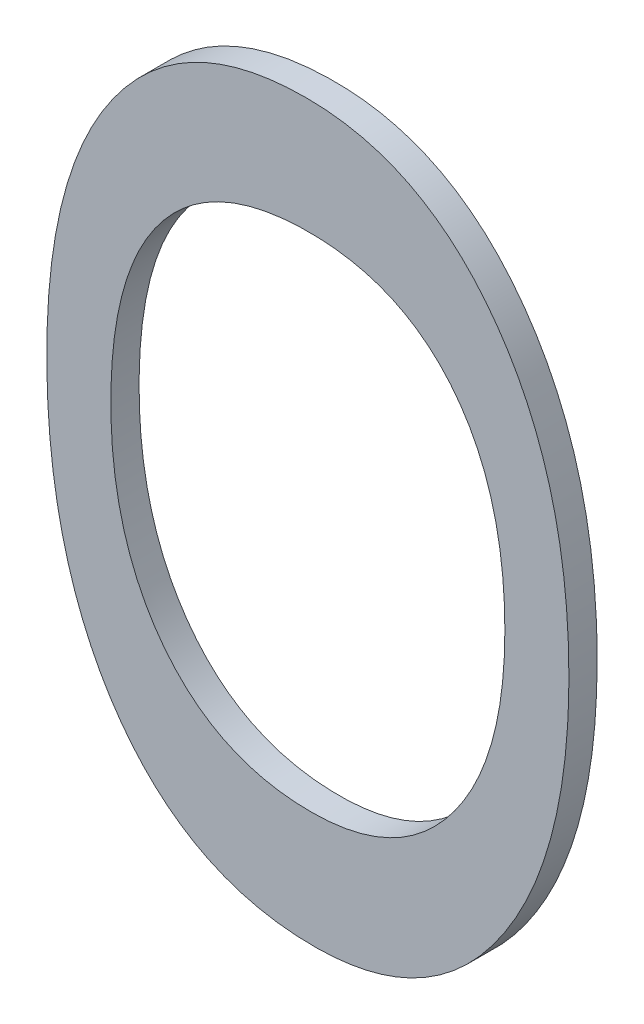
ISO-10303-21;
HEADER;
FILE_DESCRIPTION(('STEP AP214'),'2;1');
FILE_NAME('part.step','',(''),(''),'','','');
FILE_SCHEMA(('AUTOMOTIVE_DESIGN { 1 0 10303 214 1 1 1 1 }'));
ENDSEC;
DATA;
#1=APPLICATION_CONTEXT('core data for automotive mechanical design processes');
#2=APPLICATION_PROTOCOL_DEFINITION('international standard','automotive_design',2000,#1);
#3=PRODUCT_CONTEXT('',#1,'mechanical');
#4=PRODUCT('Part','Part','',(#3));
#5=PRODUCT_RELATED_PRODUCT_CATEGORY('part','',(#4));
#6=PRODUCT_DEFINITION_FORMATION('','',#4);
#7=PRODUCT_DEFINITION_CONTEXT('part definition',#1,'design');
#8=PRODUCT_DEFINITION('design','',#6,#7);
#9=PRODUCT_DEFINITION_SHAPE('','',#8);
#10=(LENGTH_UNIT() NAMED_UNIT(*) SI_UNIT(.MILLI.,.METRE.));
#11=(NAMED_UNIT(*) PLANE_ANGLE_UNIT() SI_UNIT($,.RADIAN.));
#12=(NAMED_UNIT(*) SI_UNIT($,.STERADIAN.) SOLID_ANGLE_UNIT());
#13=UNCERTAINTY_MEASURE_WITH_UNIT(LENGTH_MEASURE(1.E-05),#10,'distance_accuracy_value','');
#14=(GEOMETRIC_REPRESENTATION_CONTEXT(3) GLOBAL_UNCERTAINTY_ASSIGNED_CONTEXT((#13)) GLOBAL_UNIT_ASSIGNED_CONTEXT((#10,
#11,#12)) REPRESENTATION_CONTEXT('',''));
#15=CARTESIAN_POINT('',(0.,0.,0.));
#16=DIRECTION('',(0.,0.,1.));
#17=DIRECTION('',(1.,0.,0.));
#18=AXIS2_PLACEMENT_3D('',#15,#16,#17);
#19=CARTESIAN_POINT('',(-8.95983005625009,-22.7704584365744,333.160489148867));
#20=DIRECTION('',(0.,0.,1.));
#21=DIRECTION('',(1.,0.,0.));
#22=AXIS2_PLACEMENT_3D('',#19,#20,#21);
#23=PLANE('',#22);
#24=CARTESIAN_POINT('',(-6.29001147151449,-29.387682783152,333.160489148867));
#25=CARTESIAN_POINT('',(-6.29001147151449,-30.5322329388856,333.160489148867));
#26=CARTESIAN_POINT('',(-6.5358426870482,-31.4576896970962,333.160489148867));
#27=CARTESIAN_POINT('',(-7.51916511930408,-32.8704193496428,333.160489148867));
#28=CARTESIAN_POINT('',(-8.17524647300516,-33.2236014417225,333.160489148867));
#29=CARTESIAN_POINT('',(-9.87690675396641,-33.2236014417225,333.160489148867));
#30=CARTESIAN_POINT('',(-10.5705007487846,-32.8632360645508,333.160489148867));
#31=CARTESIAN_POINT('',(-11.5825575457215,-31.4217732975757,333.160489148867));
#32=CARTESIAN_POINT('',(-11.8355718681491,-30.4412435124195,333.160489148867));
#33=CARTESIAN_POINT('',(-11.8355718681491,-28.0324207393664,333.160489148867));
#34=CARTESIAN_POINT('',(-11.5913376108739,-27.1165410723687,333.160489148867));
#35=CARTESIAN_POINT('',(-10.6143992419472,-25.7900127608683,333.160489148867));
#36=CARTESIAN_POINT('',(-9.93916261334142,-25.4583802127562,333.160489148867));
#37=CARTESIAN_POINT('',(-8.24069481584198,-25.4583802127562,333.160489148867));
#38=CARTESIAN_POINT('',(-7.56705473886371,-25.8175489856235,333.160489148867));
#39=CARTESIAN_POINT('',(-6.54541987593813,-27.2542223101119,333.160489148867));
#40=CARTESIAN_POINT('',(-6.29001147151449,-28.2048215807125,333.160489148867));
#41=CARTESIAN_POINT('',(-6.29001147151449,-29.387682783152,333.160489148867));
#42=(BOUNDED_CURVE() B_SPLINE_CURVE(3,(#24,#25,#26,#27,#28,#29,#30,#31,#32,#33,#34,#35,#36,#37,
#38,#39,#40,#41),.UNSPECIFIED.,.T.,.F.) B_SPLINE_CURVE_WITH_KNOTS((4,2,2,2,2,2,2,2,4),(0.,
0.122928190053667,0.245856351944826,0.377872553464439,0.509888688329001,0.634259060932158,
0.758629365308048,0.879314652967576,1.),
.UNSPECIFIED.) CURVE() GEOMETRIC_REPRESENTATION_ITEM() RATIONAL_B_SPLINE_CURVE((1.,1.,1.,1.,1.,
1.,1.,1.,1.,1.,1.,1.,1.,1.,1.,1.,1.,1.)) REPRESENTATION_ITEM(''));
#43=CARTESIAN_POINT('',(-6.29001147151449,-29.387682783152,333.160489148867));
#44=VERTEX_POINT('',#43);
#45=EDGE_CURVE('E11',#44,#44,#42,.T.);
#46=ORIENTED_EDGE('',*,*,#45,.T.);
#47=EDGE_LOOP('',(#46));
#48=FACE_BOUND('',#47,.T.);
#49=CARTESIAN_POINT('',(-6.97003701237988,-29.301482318635,333.160489148867));
#50=CARTESIAN_POINT('',(-6.97003701237988,-28.4682115679244,333.160489148867));
#51=CARTESIAN_POINT('',(-7.15201513136967,-27.822905579865,333.160489148867));
#52=CARTESIAN_POINT('',(-7.8799303417068,-26.9082241476223,333.160489148867));
#53=CARTESIAN_POINT('',(-8.39074752468784,-26.6795522910559,333.160489148867));
#54=CARTESIAN_POINT('',(-9.72206513286093,-26.6795534001588,333.160489148867));
#55=CARTESIAN_POINT('',(-10.2416626137619,-26.9058290999534,333.160489148867));
#56=CARTESIAN_POINT('',(-10.9727692599526,-27.8109333602922,333.160489148867));
#57=CARTESIAN_POINT('',(-11.1555467101181,-28.458634117539,333.160489148867));
#58=CARTESIAN_POINT('',(-11.1555459531499,-30.1251753032849,333.160489148867));
#59=CARTESIAN_POINT('',(-10.9663841527485,-30.7812563704403,333.160489148867));
#60=CARTESIAN_POINT('',(-10.2097361560097,-31.7581942902802,333.160489148867));
#61=CARTESIAN_POINT('',(-9.69013917584141,-32.0024288155206,333.160489148867));
#62=CARTESIAN_POINT('',(-8.4035178326689,-32.0024288155206,333.160489148867));
#63=CARTESIAN_POINT('',(-7.90387503822888,-31.7569971463801,333.160489148867));
#64=CARTESIAN_POINT('',(-7.15680459050488,-30.7752701425276,333.160489148867));
#65=CARTESIAN_POINT('',(-6.97003701237988,-30.1203862974918,333.160489148867));
#66=CARTESIAN_POINT('',(-6.97003701237988,-29.301482318635,333.160489148867));
#67=(BOUNDED_CURVE() B_SPLINE_CURVE(3,(#49,#50,#51,#52,#53,#54,#55,#56,#57,#58,#59,#60,#61,#62,
#63,#64,#65,#66),.UNSPECIFIED.,.T.,.F.) B_SPLINE_CURVE_WITH_KNOTS((4,2,2,2,2,2,2,2,4),(0.,
0.125847552098494,0.251694915101053,0.380596777442791,0.509498684426021,0.635471067533667,
0.761443497351189,0.880721770265637,1.),
.UNSPECIFIED.) CURVE() GEOMETRIC_REPRESENTATION_ITEM() RATIONAL_B_SPLINE_CURVE((1.,1.,1.,1.,1.,
1.,1.,1.,1.,1.,1.,1.,1.,1.,1.,1.,1.,1.)) REPRESENTATION_ITEM(''));
#68=CARTESIAN_POINT('',(-6.97003701237988,-29.301482318635,333.160489148867));
#69=VERTEX_POINT('',#68);
#70=EDGE_CURVE('E46',#69,#69,#67,.T.);
#71=ORIENTED_EDGE('',*,*,#70,.T.);
#72=EDGE_LOOP('',(#71));
#73=FACE_BOUND('',#72,.T.);
#74=ADVANCED_FACE('F43',(#48,#73),#23,.F.);
#75=CARTESIAN_POINT('',(-6.29001147151449,-29.387682783152,332.960489148867));
#76=CARTESIAN_POINT('',(-6.29001147151449,-30.5322329388856,332.960489148867));
#77=CARTESIAN_POINT('',(-6.5358426870482,-31.4576896970962,332.960489148867));
#78=CARTESIAN_POINT('',(-7.51916511930408,-32.8704193496428,332.960489148867));
#79=CARTESIAN_POINT('',(-8.17524647300516,-33.2236014417225,332.960489148867));
#80=CARTESIAN_POINT('',(-9.87690675396641,-33.2236014417225,332.960489148867));
#81=CARTESIAN_POINT('',(-10.5705007487846,-32.8632360645508,332.960489148867));
#82=CARTESIAN_POINT('',(-11.5825575457215,-31.4217732975757,332.960489148867));
#83=CARTESIAN_POINT('',(-11.8355718681491,-30.4412435124195,332.960489148867));
#84=CARTESIAN_POINT('',(-11.8355718681491,-28.0324207393664,332.960489148867));
#85=CARTESIAN_POINT('',(-11.5913376108739,-27.1165410723687,332.960489148867));
#86=CARTESIAN_POINT('',(-10.6143992419472,-25.7900127608683,332.960489148867));
#87=CARTESIAN_POINT('',(-9.93916261334142,-25.4583802127562,332.960489148867));
#88=CARTESIAN_POINT('',(-8.24069481584198,-25.4583802127562,332.960489148867));
#89=CARTESIAN_POINT('',(-7.56705473886371,-25.8175489856235,332.960489148867));
#90=CARTESIAN_POINT('',(-6.54541987593813,-27.2542223101119,332.960489148867));
#91=CARTESIAN_POINT('',(-6.29001147151449,-28.2048215807125,332.960489148867));
#92=CARTESIAN_POINT('',(-6.29001147151449,-29.387682783152,332.960489148867));
#93=(BOUNDED_CURVE() B_SPLINE_CURVE(3,(#75,#76,#77,#78,#79,#80,#81,#82,#83,#84,#85,#86,#87,#88,
#89,#90,#91,#92),.UNSPECIFIED.,.T.,.F.) B_SPLINE_CURVE_WITH_KNOTS((4,2,2,2,2,2,2,2,4),(0.,
0.122928190053667,0.245856351944826,0.377872553464439,0.509888688329001,0.634259060932158,
0.758629365308048,0.879314652967576,1.),
.UNSPECIFIED.) CURVE() GEOMETRIC_REPRESENTATION_ITEM() RATIONAL_B_SPLINE_CURVE((1.,1.,1.,1.,1.,
1.,1.,1.,1.,1.,1.,1.,1.,1.,1.,1.,1.,1.)) REPRESENTATION_ITEM(''));
#94=DIRECTION('',(0.,0.,1.));
#95=VECTOR('',#94,1.);
#96=SURFACE_OF_LINEAR_EXTRUSION('',#93,#95);
#97=ORIENTED_EDGE('',*,*,#45,.F.);
#98=EDGE_LOOP('',(#97));
#99=FACE_BOUND('',#98,.T.);
#100=CARTESIAN_POINT('',(-6.29001147151449,-29.387682783152,333.460489148867));
#101=CARTESIAN_POINT('',(-6.29001147151449,-28.2048215807125,333.460489148867));
#102=CARTESIAN_POINT('',(-6.54541987593813,-27.2542223101119,333.460489148867));
#103=CARTESIAN_POINT('',(-7.56705473886371,-25.8175489856235,333.460489148867));
#104=CARTESIAN_POINT('',(-8.24069481584198,-25.4583802127562,333.460489148867));
#105=CARTESIAN_POINT('',(-9.93916261334142,-25.4583802127562,333.460489148867));
#106=CARTESIAN_POINT('',(-10.6143992419472,-25.7900127608683,333.460489148867));
#107=CARTESIAN_POINT('',(-11.5913376108739,-27.1165410723687,333.460489148867));
#108=CARTESIAN_POINT('',(-11.8355718681491,-28.0324207393664,333.460489148867));
#109=CARTESIAN_POINT('',(-11.8355718681491,-30.4412435124195,333.460489148867));
#110=CARTESIAN_POINT('',(-11.5825575457215,-31.4217732975757,333.460489148867));
#111=CARTESIAN_POINT('',(-10.5705007487846,-32.8632360645508,333.460489148867));
#112=CARTESIAN_POINT('',(-9.87690675396641,-33.2236014417225,333.460489148867));
#113=CARTESIAN_POINT('',(-8.17524647300516,-33.2236014417225,333.460489148867));
#114=CARTESIAN_POINT('',(-7.51916511930408,-32.8704193496428,333.460489148867));
#115=CARTESIAN_POINT('',(-6.5358426870482,-31.4576896970962,333.460489148867));
#116=CARTESIAN_POINT('',(-6.29001147151449,-30.5322329388856,333.460489148867));
#117=CARTESIAN_POINT('',(-6.29001147151449,-29.387682783152,333.460489148867));
#118=(BOUNDED_CURVE() B_SPLINE_CURVE(3,(#100,#101,#102,#103,#104,#105,#106,#107,#108,#109,#110,
#111,#112,#113,#114,#115,#116,#117),.UNSPECIFIED.,.T.,.F.) B_SPLINE_CURVE_WITH_KNOTS((4,2,2,2,2,
2,2,2,4),(0.,0.120685347032424,0.241370634691952,0.365740939067842,0.490111311670999,
0.622127446535561,0.754143648055174,0.877071809946333,1.),
.UNSPECIFIED.) CURVE() GEOMETRIC_REPRESENTATION_ITEM() RATIONAL_B_SPLINE_CURVE((1.,1.,1.,1.,1.,
1.,1.,1.,1.,1.,1.,1.,1.,1.,1.,1.,1.,1.)) REPRESENTATION_ITEM(''));
#119=CARTESIAN_POINT('',(-6.29001147151449,-29.387682783152,333.460489148867));
#120=VERTEX_POINT('',#119);
#121=EDGE_CURVE('E53',#120,#120,#118,.T.);
#122=ORIENTED_EDGE('',*,*,#121,.F.);
#123=EDGE_LOOP('',(#122));
#124=FACE_BOUND('',#123,.T.);
#125=ADVANCED_FACE('F103',(#99,#124),#96,.F.);
#126=CARTESIAN_POINT('',(-11.8313130441182,-29.475263028758,333.460489148867));
#127=DIRECTION('',(0.,0.,-1.));
#128=DIRECTION('',(0.,-1.,0.));
#129=AXIS2_PLACEMENT_3D('',#126,#127,#128);
#130=PLANE('',#129);
#131=ORIENTED_EDGE('',*,*,#121,.T.);
#132=EDGE_LOOP('',(#131));
#133=FACE_BOUND('',#132,.T.);
#134=CARTESIAN_POINT('',(-6.97003701237988,-29.301482318635,333.460489148867));
#135=CARTESIAN_POINT('',(-6.97003701237988,-30.1203862974918,333.460489148867));
#136=CARTESIAN_POINT('',(-7.15680459050488,-30.7752701425276,333.460489148867));
#137=CARTESIAN_POINT('',(-7.90387503822888,-31.7569971463801,333.460489148867));
#138=CARTESIAN_POINT('',(-8.4035178326689,-32.0024288155206,333.460489148867));
#139=CARTESIAN_POINT('',(-9.69013917584141,-32.0024288155206,333.460489148867));
#140=CARTESIAN_POINT('',(-10.2097361560097,-31.7581942902802,333.460489148867));
#141=CARTESIAN_POINT('',(-10.9663841527485,-30.7812563704403,333.460489148867));
#142=CARTESIAN_POINT('',(-11.1555459531499,-30.1251753032849,333.460489148867));
#143=CARTESIAN_POINT('',(-11.1555467101181,-28.458634117539,333.460489148867));
#144=CARTESIAN_POINT('',(-10.9727692599526,-27.8109333602922,333.460489148867));
#145=CARTESIAN_POINT('',(-10.2416626137619,-26.9058290999534,333.460489148867));
#146=CARTESIAN_POINT('',(-9.72206513286093,-26.6795534001588,333.460489148867));
#147=CARTESIAN_POINT('',(-8.39074752468784,-26.6795522910559,333.460489148867));
#148=CARTESIAN_POINT('',(-7.8799303417068,-26.9082241476223,333.460489148867));
#149=CARTESIAN_POINT('',(-7.15201513136967,-27.822905579865,333.460489148867));
#150=CARTESIAN_POINT('',(-6.97003701237988,-28.4682115679244,333.460489148867));
#151=CARTESIAN_POINT('',(-6.97003701237988,-29.301482318635,333.460489148867));
#152=(BOUNDED_CURVE() B_SPLINE_CURVE(3,(#134,#135,#136,#137,#138,#139,#140,#141,#142,#143,#144,
#145,#146,#147,#148,#149,#150,#151),.UNSPECIFIED.,.T.,.F.) B_SPLINE_CURVE_WITH_KNOTS((4,2,2,2,2,
2,2,2,4),(0.,0.119278229734363,0.238556502648811,0.364528932466333,0.490501315573979,
0.619403222557209,0.748305084898947,0.874152447901506,1.),
.UNSPECIFIED.) CURVE() GEOMETRIC_REPRESENTATION_ITEM() RATIONAL_B_SPLINE_CURVE((1.,1.,1.,1.,1.,
1.,1.,1.,1.,1.,1.,1.,1.,1.,1.,1.,1.,1.)) REPRESENTATION_ITEM(''));
#153=CARTESIAN_POINT('',(-6.97003701237988,-29.301482318635,333.460489148867));
#154=VERTEX_POINT('',#153);
#155=EDGE_CURVE('E68',#154,#154,#152,.T.);
#156=ORIENTED_EDGE('',*,*,#155,.T.);
#157=EDGE_LOOP('',(#156));
#158=FACE_BOUND('',#157,.T.);
#159=ADVANCED_FACE('F69',(#133,#158),#130,.F.);
#160=CARTESIAN_POINT('',(-6.97003701237988,-29.301482318635,332.960489148867));
#161=CARTESIAN_POINT('',(-6.97003701237988,-28.4682115679244,332.960489148867));
#162=CARTESIAN_POINT('',(-7.15201513136967,-27.822905579865,332.960489148867));
#163=CARTESIAN_POINT('',(-7.8799303417068,-26.9082241476223,332.960489148867));
#164=CARTESIAN_POINT('',(-8.39074752468784,-26.6795522910559,332.960489148867));
#165=CARTESIAN_POINT('',(-9.72206513286093,-26.6795534001588,332.960489148867));
#166=CARTESIAN_POINT('',(-10.2416626137619,-26.9058290999534,332.960489148867));
#167=CARTESIAN_POINT('',(-10.9727692599526,-27.8109333602922,332.960489148867));
#168=CARTESIAN_POINT('',(-11.1555467101181,-28.458634117539,332.960489148867));
#169=CARTESIAN_POINT('',(-11.1555459531499,-30.1251753032849,332.960489148867));
#170=CARTESIAN_POINT('',(-10.9663841527485,-30.7812563704403,332.960489148867));
#171=CARTESIAN_POINT('',(-10.2097361560097,-31.7581942902802,332.960489148867));
#172=CARTESIAN_POINT('',(-9.69013917584141,-32.0024288155206,332.960489148867));
#173=CARTESIAN_POINT('',(-8.4035178326689,-32.0024288155206,332.960489148867));
#174=CARTESIAN_POINT('',(-7.90387503822888,-31.7569971463801,332.960489148867));
#175=CARTESIAN_POINT('',(-7.15680459050488,-30.7752701425276,332.960489148867));
#176=CARTESIAN_POINT('',(-6.97003701237988,-30.1203862974918,332.960489148867));
#177=CARTESIAN_POINT('',(-6.97003701237988,-29.301482318635,332.960489148867));
#178=(BOUNDED_CURVE() B_SPLINE_CURVE(3,(#160,#161,#162,#163,#164,#165,#166,#167,#168,#169,#170,
#171,#172,#173,#174,#175,#176,#177),.UNSPECIFIED.,.T.,.F.) B_SPLINE_CURVE_WITH_KNOTS((4,2,2,2,2,
2,2,2,4),(0.,0.125847552098494,0.251694915101053,0.380596777442791,0.509498684426021,
0.635471067533667,0.761443497351189,0.880721770265637,1.),
.UNSPECIFIED.) CURVE() GEOMETRIC_REPRESENTATION_ITEM() RATIONAL_B_SPLINE_CURVE((1.,1.,1.,1.,1.,
1.,1.,1.,1.,1.,1.,1.,1.,1.,1.,1.,1.,1.)) REPRESENTATION_ITEM(''));
#179=DIRECTION('',(0.,0.,1.));
#180=VECTOR('',#179,1.);
#181=SURFACE_OF_LINEAR_EXTRUSION('',#178,#180);
#182=ORIENTED_EDGE('',*,*,#70,.F.);
#183=EDGE_LOOP('',(#182));
#184=FACE_BOUND('',#183,.T.);
#185=ORIENTED_EDGE('',*,*,#155,.F.);
#186=EDGE_LOOP('',(#185));
#187=FACE_BOUND('',#186,.T.);
#188=ADVANCED_FACE('F99',(#184,#187),#181,.F.);
#189=CLOSED_SHELL('',(#74,#125,#159,#188));
#190=MANIFOLD_SOLID_BREP('B2',#189);
#191=ADVANCED_BREP_SHAPE_REPRESENTATION('',(#18,#190),#14);
#192=SHAPE_DEFINITION_REPRESENTATION(#9,#191);
ENDSEC;
END-ISO-10303-21;
